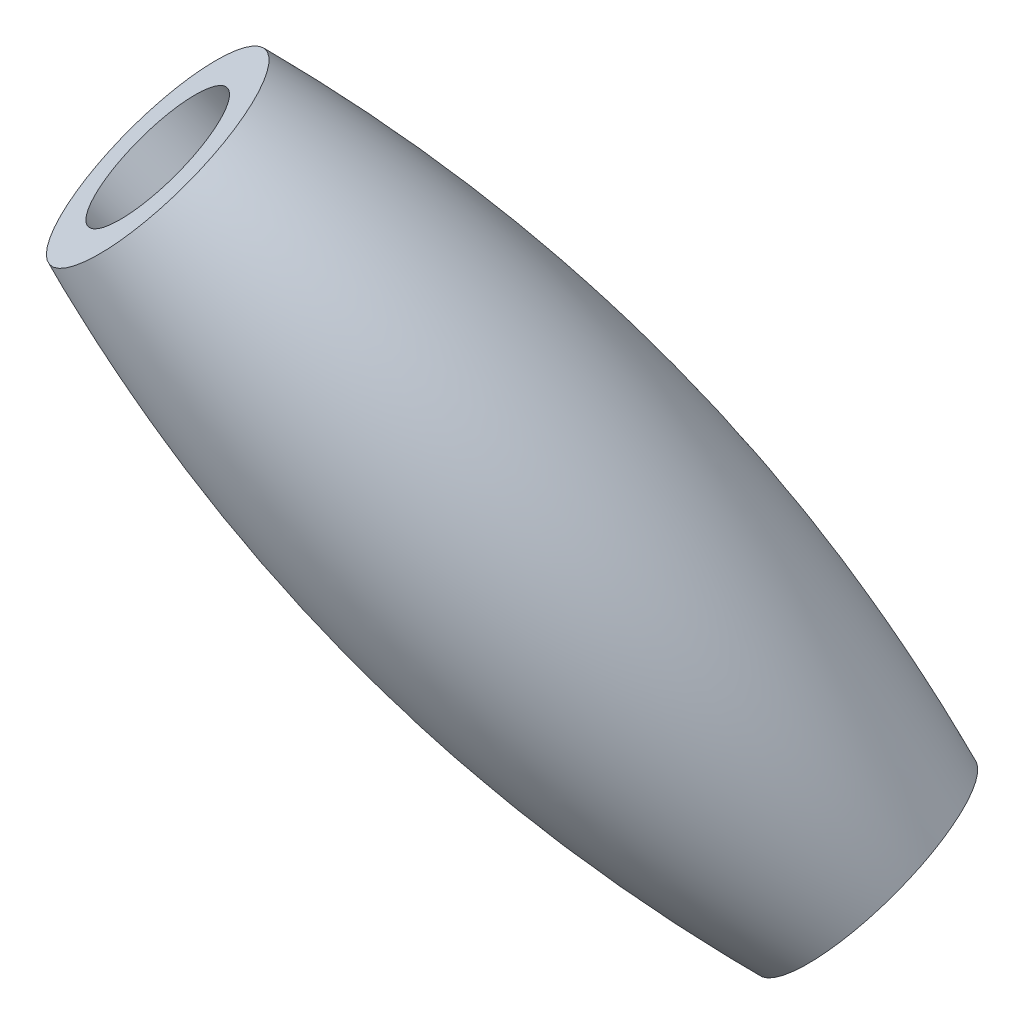
ISO-10303-21;
HEADER;
FILE_DESCRIPTION(('STEP AP214'),'2;1');
FILE_NAME('part.step','',(''),(''),'','','');
FILE_SCHEMA(('AUTOMOTIVE_DESIGN { 1 0 10303 214 1 1 1 1 }'));
ENDSEC;
DATA;
#1=APPLICATION_CONTEXT('core data for automotive mechanical design processes');
#2=APPLICATION_PROTOCOL_DEFINITION('international standard','automotive_design',2000,#1);
#3=PRODUCT_CONTEXT('',#1,'mechanical');
#4=PRODUCT('Part','Part','',(#3));
#5=PRODUCT_RELATED_PRODUCT_CATEGORY('part','',(#4));
#6=PRODUCT_DEFINITION_FORMATION('','',#4);
#7=PRODUCT_DEFINITION_CONTEXT('part definition',#1,'design');
#8=PRODUCT_DEFINITION('design','',#6,#7);
#9=PRODUCT_DEFINITION_SHAPE('','',#8);
#10=(LENGTH_UNIT() NAMED_UNIT(*) SI_UNIT(.MILLI.,.METRE.));
#11=(NAMED_UNIT(*) PLANE_ANGLE_UNIT() SI_UNIT($,.RADIAN.));
#12=(NAMED_UNIT(*) SI_UNIT($,.STERADIAN.) SOLID_ANGLE_UNIT());
#13=UNCERTAINTY_MEASURE_WITH_UNIT(LENGTH_MEASURE(1.E-05),#10,'distance_accuracy_value','');
#14=(GEOMETRIC_REPRESENTATION_CONTEXT(3) GLOBAL_UNCERTAINTY_ASSIGNED_CONTEXT((#13)) GLOBAL_UNIT_ASSIGNED_CONTEXT((#10,
#11,#12)) REPRESENTATION_CONTEXT('',''));
#15=CARTESIAN_POINT('',(0.,0.,0.));
#16=DIRECTION('',(0.,0.,1.));
#17=DIRECTION('',(1.,0.,0.));
#18=AXIS2_PLACEMENT_3D('',#15,#16,#17);
#19=CARTESIAN_POINT('',(-38.93092870217,-1.401400444374,-42.32217141204));
#20=CARTESIAN_POINT('',(-38.82071868273,-1.484652197579,-42.40318635415));
#21=CARTESIAN_POINT('',(-33.08855049394,-5.833603400683,-46.60929335822));
#22=CARTESIAN_POINT('',(-22.51932649894,-15.80656928184,-53.58100165231));
#23=CARTESIAN_POINT('',(-13.48994734998,-28.44464568726,-57.8854892053));
#24=CARTESIAN_POINT('',(-9.327789765184,-35.51091086095,-59.37212684286));
#25=CARTESIAN_POINT('',(-9.247924637398,-35.64700329285,-59.40045165888));
#26=B_SPLINE_CURVE_WITH_KNOTS('',3,(#19,#20,#21,#22,#23,#24,#25),.UNSPECIFIED.,.F.,.F.,(4,1,1,1,
4),(0.,0.009600436894524,0.499994266707,0.9903880965195,1.),.UNSPECIFIED.);
#27=CARTESIAN_POINT('',(-10.66959983727,-41.48281690256,-55.58432737238));
#28=DIRECTION('',(-0.612900580539983,0.707106781179971,0.352637034899984));
#29=AXIS1_PLACEMENT('',#27,#28);
#30=SURFACE_OF_REVOLUTION('',#26,#29);
#31=CARTESIAN_POINT('',(-12.1252387160189,-39.8034382972963,-54.7468144145119));
#32=DIRECTION('',(-0.612900580539983,0.707106781179971,0.352637034899984));
#33=DIRECTION('',(-0.755649570700657,-0.654976126511427,0.));
#34=AXIS2_PLACEMENT_3D('',#31,#32,#33);
#35=CIRCLE('',#34,6.9750000000199);
#36=CARTESIAN_POINT('',(-17.395894471671,-44.3718967797265,-54.7468144145119));
#37=VERTEX_POINT('',#36);
#38=EDGE_CURVE('E45',#37,#37,#35,.T.);
#39=ORIENTED_EDGE('',*,*,#38,.T.);
#40=EDGE_LOOP('',(#39));
#41=FACE_BOUND('',#40,.T.);
#42=CARTESIAN_POINT('',(-41.238016291736,-6.21586619116923,-37.9965552567235));
#43=DIRECTION('',(-0.612900580539983,0.707106781179971,0.352637034899984));
#44=DIRECTION('',(-0.755649570700657,-0.654976126511427,0.));
#45=AXIS2_PLACEMENT_3D('',#42,#43,#44);
#46=CIRCLE('',#45,6.97500000037036);
#47=CARTESIAN_POINT('',(-46.508672047653,-10.784324673829,-37.9965552567235));
#48=VERTEX_POINT('',#47);
#49=EDGE_CURVE('E19',#48,#48,#46,.T.);
#50=ORIENTED_EDGE('',*,*,#49,.F.);
#51=EDGE_LOOP('',(#50));
#52=FACE_BOUND('',#51,.T.);
#53=ADVANCED_FACE('F15',(#41,#52),#30,.F.);
#54=CARTESIAN_POINT('',(-43.53449769777,-3.416229699845,-47.60177648894));
#55=DIRECTION('',(-0.612900580533215,0.707106781186673,0.352637034898307));
#56=DIRECTION('',(-0.3781045575869,-0.654330019278762,0.654896304312881));
#57=AXIS2_PLACEMENT_3D('',#54,#55,#56);
#58=PLANE('',#57);
#59=CARTESIAN_POINT('',(-41.2380162917227,-6.21586619118462,-37.9965552567312));
#60=DIRECTION('',(-0.612900580539983,0.707106781179971,0.352637034899984));
#61=DIRECTION('',(-0.755649570700657,-0.654976126511427,0.));
#62=AXIS2_PLACEMENT_3D('',#59,#60,#61);
#63=CIRCLE('',#62,4.49999999961696);
#64=CARTESIAN_POINT('',(-44.6384393595862,-9.16325876023517,-37.9965552567312));
#65=VERTEX_POINT('',#64);
#66=EDGE_CURVE('E43',#65,#65,#63,.T.);
#67=ORIENTED_EDGE('',*,*,#66,.F.);
#68=EDGE_LOOP('',(#67));
#69=FACE_BOUND('',#68,.T.);
#70=ORIENTED_EDGE('',*,*,#49,.T.);
#71=EDGE_LOOP('',(#70));
#72=FACE_BOUND('',#71,.T.);
#73=ADVANCED_FACE('F52',(#69,#72),#58,.T.);
#74=CARTESIAN_POINT('',(-14.42172012244,-37.00380180621,-64.35203564661));
#75=DIRECTION('',(-0.612900580533352,0.70710678118662,0.352637034898176));
#76=DIRECTION('',(-0.378104557586644,-0.654330019278663,0.654896304313127));
#77=AXIS2_PLACEMENT_3D('',#74,#75,#76);
#78=PLANE('',#77);
#79=CARTESIAN_POINT('',(-12.1252387160742,-39.8034382972325,-54.74681441448));
#80=DIRECTION('',(-0.612900580539983,0.707106781179971,0.352637034899984));
#81=DIRECTION('',(-0.755649570700657,-0.654976126511427,0.));
#82=AXIS2_PLACEMENT_3D('',#79,#80,#81);
#83=CIRCLE('',#82,4.49999999997175);
#84=CARTESIAN_POINT('',(-15.5256617842058,-42.7508308665154,-54.74681441448));
#85=VERTEX_POINT('',#84);
#86=EDGE_CURVE('E40',#85,#85,#83,.F.);
#87=ORIENTED_EDGE('',*,*,#86,.F.);
#88=EDGE_LOOP('',(#87));
#89=FACE_BOUND('',#88,.T.);
#90=ORIENTED_EDGE('',*,*,#38,.F.);
#91=EDGE_LOOP('',(#90));
#92=FACE_BOUND('',#91,.T.);
#93=ADVANCED_FACE('F60',(#89,#92),#78,.F.);
#94=CARTESIAN_POINT('',(-38.7251239115131,-9.11500399401746,-39.4423670998186));
#95=DIRECTION('',(-0.612900580539983,0.707106781179971,0.352637034899984));
#96=DIRECTION('',(-0.755649570700657,-0.654976126511427,0.));
#97=AXIS2_PLACEMENT_3D('',#94,#95,#96);
#98=CYLINDRICAL_SURFACE('',#97,4.49999999961696);
#99=CARTESIAN_POINT('',(-38.7251239115131,-9.11500399401745,-39.4423670998186));
#100=DIRECTION('',(-0.612900580539983,0.707106781179971,0.352637034899984));
#101=DIRECTION('',(-0.755649570700657,-0.654976126511427,0.));
#102=AXIS2_PLACEMENT_3D('',#99,#100,#101);
#103=CIRCLE('',#102,4.49999999961696);
#104=CARTESIAN_POINT('',(-42.1255469793767,-12.062396563068,-39.4423670998186));
#105=VERTEX_POINT('',#104);
#106=EDGE_CURVE('E37',#105,#105,#103,.T.);
#107=ORIENTED_EDGE('',*,*,#106,.F.);
#108=EDGE_LOOP('',(#107));
#109=FACE_BOUND('',#108,.T.);
#110=ORIENTED_EDGE('',*,*,#66,.T.);
#111=EDGE_LOOP('',(#110));
#112=FACE_BOUND('',#111,.T.);
#113=ADVANCED_FACE('F76',(#109,#112),#98,.F.);
#114=CARTESIAN_POINT('',(-12.1252387160742,-39.8034382972325,-54.74681441448));
#115=DIRECTION('',(-0.612900580539983,0.707106781179971,0.352637034899984));
#116=DIRECTION('',(-0.755649570700657,-0.654976126511427,0.));
#117=AXIS2_PLACEMENT_3D('',#114,#115,#116);
#118=CYLINDRICAL_SURFACE('',#117,4.49999999997175);
#119=CARTESIAN_POINT('',(-14.6381310962875,-36.9043004943954,-53.3010025713905));
#120=DIRECTION('',(-0.612900580539983,0.707106781179971,0.352637034899984));
#121=DIRECTION('',(-0.755649570700657,-0.654976126511427,0.));
#122=AXIS2_PLACEMENT_3D('',#119,#120,#121);
#123=CIRCLE('',#122,4.49999999997175);
#124=CARTESIAN_POINT('',(-18.0385541644191,-39.8516930636783,-53.3010025713905));
#125=VERTEX_POINT('',#124);
#126=EDGE_CURVE('E28',#125,#125,#123,.T.);
#127=ORIENTED_EDGE('',*,*,#126,.T.);
#128=EDGE_LOOP('',(#127));
#129=FACE_BOUND('',#128,.T.);
#130=ORIENTED_EDGE('',*,*,#86,.T.);
#131=EDGE_LOOP('',(#130));
#132=FACE_BOUND('',#131,.T.);
#133=ADVANCED_FACE('F74',(#129,#132),#118,.F.);
#134=CARTESIAN_POINT('',(-40.20783112329,-7.309214314484,-45.64034979135));
#135=DIRECTION('',(-0.612900580532911,0.707106781186828,0.352637034898525));
#136=DIRECTION('',(-0.378104557586636,-0.65433001927859,0.654896304313205));
#137=AXIS2_PLACEMENT_3D('',#134,#135,#136);
#138=PLANE('',#137);
#139=CARTESIAN_POINT('',(-38.7251239114984,-9.1150039940345,-39.442367099827));
#140=DIRECTION('',(-0.612900580539982,0.707106781179971,0.352637034899985));
#141=DIRECTION('',(-0.755649570700657,-0.654976126511427,0.));
#142=AXIS2_PLACEMENT_3D('',#139,#140,#141);
#143=CIRCLE('',#142,2.49999999979374);
#144=CARTESIAN_POINT('',(-40.6142478380942,-10.752444310178,-39.442367099827));
#145=VERTEX_POINT('',#144);
#146=EDGE_CURVE('E23',#145,#145,#143,.T.);
#147=ORIENTED_EDGE('',*,*,#146,.F.);
#148=EDGE_LOOP('',(#147));
#149=FACE_BOUND('',#148,.T.);
#150=ORIENTED_EDGE('',*,*,#106,.T.);
#151=EDGE_LOOP('',(#150));
#152=FACE_BOUND('',#151,.T.);
#153=ADVANCED_FACE('F71',(#149,#152),#138,.T.);
#154=CARTESIAN_POINT('',(-16.12083830833,-35.09851081512,-59.49898526285));
#155=DIRECTION('',(-0.612900580533252,0.707106781186544,0.352637034898503));
#156=DIRECTION('',(-0.378104557586531,-0.654330019278833,0.654896304313023));
#157=AXIS2_PLACEMENT_3D('',#154,#155,#156);
#158=PLANE('',#157);
#159=CARTESIAN_POINT('',(-14.638131096277,-36.9043004944074,-53.3010025713965));
#160=DIRECTION('',(-0.612900580539982,0.707106781179971,0.352637034899985));
#161=DIRECTION('',(-0.755649570700657,-0.654976126511427,0.));
#162=AXIS2_PLACEMENT_3D('',#159,#160,#161);
#163=CIRCLE('',#162,2.49999999979374);
#164=CARTESIAN_POINT('',(-16.5272550228728,-38.5417408105509,-53.3010025713965));
#165=VERTEX_POINT('',#164);
#166=EDGE_CURVE('E10',#165,#165,#163,.F.);
#167=ORIENTED_EDGE('',*,*,#166,.F.);
#168=EDGE_LOOP('',(#167));
#169=FACE_BOUND('',#168,.T.);
#170=ORIENTED_EDGE('',*,*,#126,.F.);
#171=EDGE_LOOP('',(#170));
#172=FACE_BOUND('',#171,.T.);
#173=ADVANCED_FACE('F17',(#169,#172),#158,.F.);
#174=CARTESIAN_POINT('',(-14.638131096277,-36.9043004944074,-53.3010025713965));
#175=DIRECTION('',(-0.612900580539982,0.707106781179971,0.352637034899985));
#176=DIRECTION('',(-0.755649570700657,-0.654976126511427,0.));
#177=AXIS2_PLACEMENT_3D('',#174,#175,#176);
#178=CYLINDRICAL_SURFACE('',#177,2.49999999979374);
#179=ORIENTED_EDGE('',*,*,#146,.T.);
#180=EDGE_LOOP('',(#179));
#181=FACE_BOUND('',#180,.T.);
#182=ORIENTED_EDGE('',*,*,#166,.T.);
#183=EDGE_LOOP('',(#182));
#184=FACE_BOUND('',#183,.T.);
#185=ADVANCED_FACE('F64',(#181,#184),#178,.F.);
#186=CLOSED_SHELL('',(#53,#73,#93,#113,#133,#153,#173,#185));
#187=MANIFOLD_SOLID_BREP('B1',#186);
#188=ADVANCED_BREP_SHAPE_REPRESENTATION('',(#18,#187),#14);
#189=SHAPE_DEFINITION_REPRESENTATION(#9,#188);
ENDSEC;
END-ISO-10303-21;
